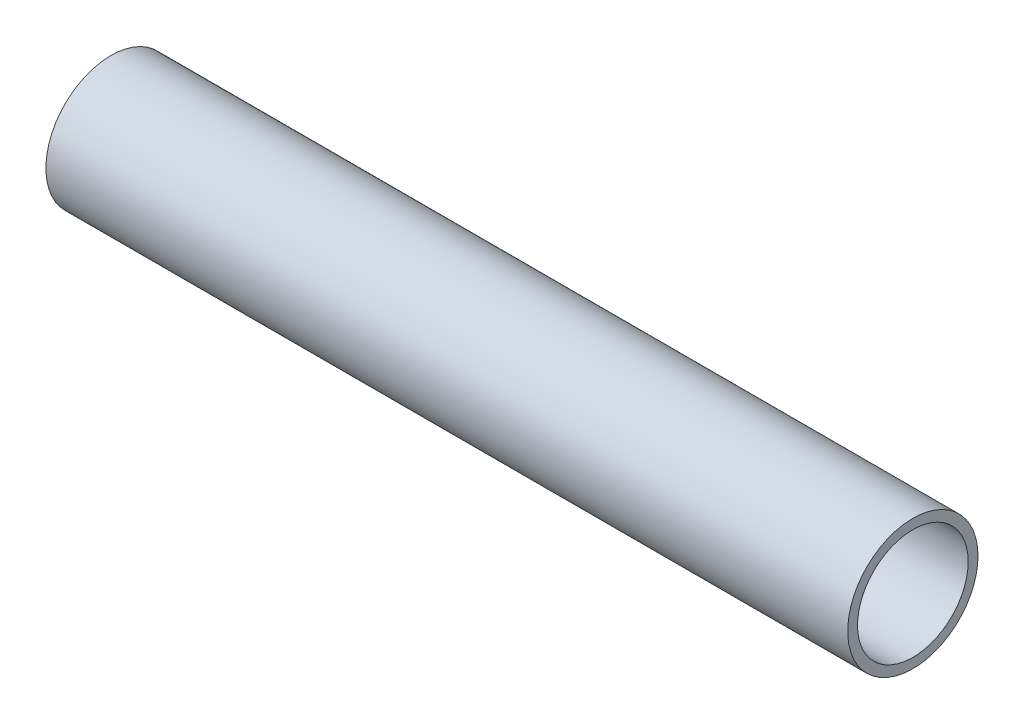
ISO-10303-21;
HEADER;
FILE_DESCRIPTION(('STEP AP214'),'2;1');
FILE_NAME('part.step','',(''),(''),'','','');
FILE_SCHEMA(('AUTOMOTIVE_DESIGN { 1 0 10303 214 1 1 1 1 }'));
ENDSEC;
DATA;
#1=APPLICATION_CONTEXT('core data for automotive mechanical design processes');
#2=APPLICATION_PROTOCOL_DEFINITION('international standard','automotive_design',2000,#1);
#3=PRODUCT_CONTEXT('',#1,'mechanical');
#4=PRODUCT('Part','Part','',(#3));
#5=PRODUCT_RELATED_PRODUCT_CATEGORY('part','',(#4));
#6=PRODUCT_DEFINITION_FORMATION('','',#4);
#7=PRODUCT_DEFINITION_CONTEXT('part definition',#1,'design');
#8=PRODUCT_DEFINITION('design','',#6,#7);
#9=PRODUCT_DEFINITION_SHAPE('','',#8);
#10=(LENGTH_UNIT() NAMED_UNIT(*) SI_UNIT(.MILLI.,.METRE.));
#11=(NAMED_UNIT(*) PLANE_ANGLE_UNIT() SI_UNIT($,.RADIAN.));
#12=(NAMED_UNIT(*) SI_UNIT($,.STERADIAN.) SOLID_ANGLE_UNIT());
#13=UNCERTAINTY_MEASURE_WITH_UNIT(LENGTH_MEASURE(1.E-05),#10,'distance_accuracy_value','');
#14=(GEOMETRIC_REPRESENTATION_CONTEXT(3) GLOBAL_UNCERTAINTY_ASSIGNED_CONTEXT((#13)) GLOBAL_UNIT_ASSIGNED_CONTEXT((#10,
#11,#12)) REPRESENTATION_CONTEXT('',''));
#15=CARTESIAN_POINT('',(0.,0.,0.));
#16=DIRECTION('',(0.,0.,1.));
#17=DIRECTION('',(1.,0.,0.));
#18=AXIS2_PLACEMENT_3D('',#15,#16,#17);
#19=CARTESIAN_POINT('',(254.,0.,0.));
#20=DIRECTION('',(1.,0.,0.));
#21=DIRECTION('',(0.,0.,-1.));
#22=AXIS2_PLACEMENT_3D('',#19,#20,#21);
#23=PLANE('',#22);
#24=CARTESIAN_POINT('',(254.,0.,0.));
#25=DIRECTION('',(1.,0.,0.));
#26=DIRECTION('',(0.,0.,-1.));
#27=AXIS2_PLACEMENT_3D('',#24,#25,#26);
#28=CIRCLE('',#27,20.6375);
#29=CARTESIAN_POINT('',(254.,0.,-20.6375));
#30=VERTEX_POINT('',#29);
#31=EDGE_CURVE('E10',#30,#30,#28,.T.);
#32=ORIENTED_EDGE('',*,*,#31,.T.);
#33=EDGE_LOOP('',(#32));
#34=FACE_BOUND('',#33,.T.);
#35=CARTESIAN_POINT('',(254.,0.,0.));
#36=DIRECTION('',(1.,0.,0.));
#37=DIRECTION('',(0.,0.,-1.));
#38=AXIS2_PLACEMENT_3D('',#35,#36,#37);
#39=CIRCLE('',#38,17.526);
#40=CARTESIAN_POINT('',(254.,0.,-17.526));
#41=VERTEX_POINT('',#40);
#42=EDGE_CURVE('E41',#41,#41,#39,.T.);
#43=ORIENTED_EDGE('',*,*,#42,.F.);
#44=EDGE_LOOP('',(#43));
#45=FACE_BOUND('',#44,.T.);
#46=ADVANCED_FACE('F30',(#34,#45),#23,.T.);
#47=CARTESIAN_POINT('',(0.,0.,0.));
#48=DIRECTION('',(1.,0.,0.));
#49=DIRECTION('',(0.,0.,-1.));
#50=AXIS2_PLACEMENT_3D('',#47,#48,#49);
#51=PLANE('',#50);
#52=CARTESIAN_POINT('',(0.,0.,0.));
#53=DIRECTION('',(1.,0.,0.));
#54=DIRECTION('',(0.,0.,-1.));
#55=AXIS2_PLACEMENT_3D('',#52,#53,#54);
#56=CIRCLE('',#55,20.6375);
#57=CARTESIAN_POINT('',(0.,0.,-20.6375));
#58=VERTEX_POINT('',#57);
#59=EDGE_CURVE('E34',#58,#58,#56,.T.);
#60=ORIENTED_EDGE('',*,*,#59,.F.);
#61=EDGE_LOOP('',(#60));
#62=FACE_BOUND('',#61,.T.);
#63=CARTESIAN_POINT('',(0.,0.,0.));
#64=DIRECTION('',(1.,0.,0.));
#65=DIRECTION('',(0.,0.,-1.));
#66=AXIS2_PLACEMENT_3D('',#63,#64,#65);
#67=CIRCLE('',#66,17.526);
#68=CARTESIAN_POINT('',(0.,0.,-17.526));
#69=VERTEX_POINT('',#68);
#70=EDGE_CURVE('E43',#69,#69,#67,.T.);
#71=ORIENTED_EDGE('',*,*,#70,.T.);
#72=EDGE_LOOP('',(#71));
#73=FACE_BOUND('',#72,.T.);
#74=ADVANCED_FACE('F53',(#62,#73),#51,.F.);
#75=CARTESIAN_POINT('',(254.,0.,0.));
#76=DIRECTION('',(-1.,0.,0.));
#77=DIRECTION('',(0.,0.,1.));
#78=AXIS2_PLACEMENT_3D('',#75,#76,#77);
#79=CYLINDRICAL_SURFACE('',#78,20.6375);
#80=ORIENTED_EDGE('',*,*,#31,.F.);
#81=EDGE_LOOP('',(#80));
#82=FACE_BOUND('',#81,.T.);
#83=ORIENTED_EDGE('',*,*,#59,.T.);
#84=EDGE_LOOP('',(#83));
#85=FACE_BOUND('',#84,.T.);
#86=ADVANCED_FACE('F32',(#82,#85),#79,.T.);
#87=CARTESIAN_POINT('',(254.,0.,0.));
#88=DIRECTION('',(-1.,0.,0.));
#89=DIRECTION('',(0.,0.,1.));
#90=AXIS2_PLACEMENT_3D('',#87,#88,#89);
#91=CYLINDRICAL_SURFACE('',#90,17.526);
#92=ORIENTED_EDGE('',*,*,#42,.T.);
#93=EDGE_LOOP('',(#92));
#94=FACE_BOUND('',#93,.T.);
#95=ORIENTED_EDGE('',*,*,#70,.F.);
#96=EDGE_LOOP('',(#95));
#97=FACE_BOUND('',#96,.T.);
#98=ADVANCED_FACE('F49',(#94,#97),#91,.F.);
#99=CLOSED_SHELL('',(#46,#74,#86,#98));
#100=MANIFOLD_SOLID_BREP('B2',#99);
#101=ADVANCED_BREP_SHAPE_REPRESENTATION('',(#18,#100),#14);
#102=SHAPE_DEFINITION_REPRESENTATION(#9,#101);
ENDSEC;
END-ISO-10303-21;
